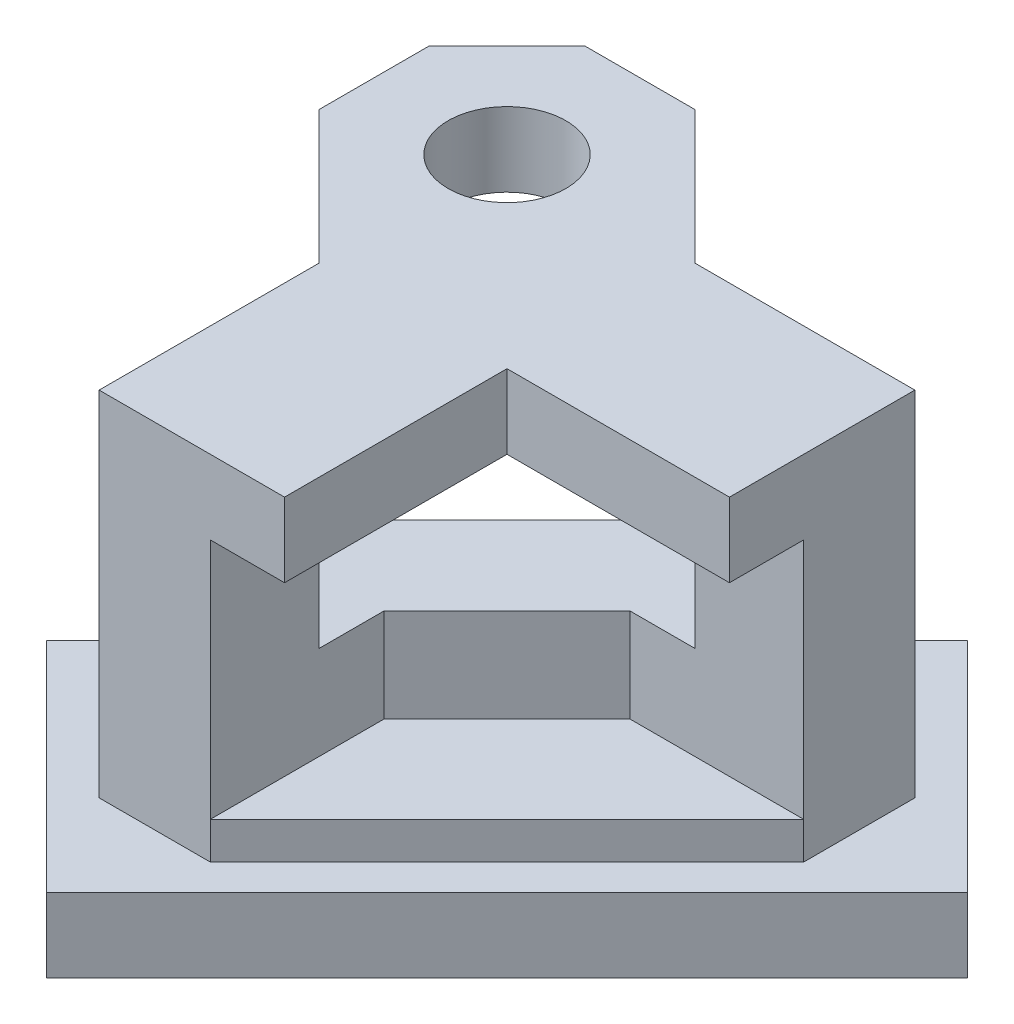
ISO-10303-21;
HEADER;
FILE_DESCRIPTION(('STEP AP214'),'2;1');
FILE_NAME('part.step','',(''),(''),'','','');
FILE_SCHEMA(('AUTOMOTIVE_DESIGN { 1 0 10303 214 1 1 1 1 }'));
ENDSEC;
DATA;
#1=APPLICATION_CONTEXT('core data for automotive mechanical design processes');
#2=APPLICATION_PROTOCOL_DEFINITION('international standard','automotive_design',2000,#1);
#3=PRODUCT_CONTEXT('',#1,'mechanical');
#4=PRODUCT('Part','Part','',(#3));
#5=PRODUCT_RELATED_PRODUCT_CATEGORY('part','',(#4));
#6=PRODUCT_DEFINITION_FORMATION('','',#4);
#7=PRODUCT_DEFINITION_CONTEXT('part definition',#1,'design');
#8=PRODUCT_DEFINITION('design','',#6,#7);
#9=PRODUCT_DEFINITION_SHAPE('','',#8);
#10=(LENGTH_UNIT() NAMED_UNIT(*) SI_UNIT(.MILLI.,.METRE.));
#11=(NAMED_UNIT(*) PLANE_ANGLE_UNIT() SI_UNIT($,.RADIAN.));
#12=(NAMED_UNIT(*) SI_UNIT($,.STERADIAN.) SOLID_ANGLE_UNIT());
#13=UNCERTAINTY_MEASURE_WITH_UNIT(LENGTH_MEASURE(1.E-05),#10,'distance_accuracy_value','');
#14=(GEOMETRIC_REPRESENTATION_CONTEXT(3) GLOBAL_UNCERTAINTY_ASSIGNED_CONTEXT((#13)) GLOBAL_UNIT_ASSIGNED_CONTEXT((#10,
#11,#12)) REPRESENTATION_CONTEXT('',''));
#15=CARTESIAN_POINT('',(0.,0.,0.));
#16=DIRECTION('',(0.,0.,1.));
#17=DIRECTION('',(1.,0.,0.));
#18=AXIS2_PLACEMENT_3D('',#15,#16,#17);
#19=CARTESIAN_POINT('',(0.,-4.,0.));
#20=DIRECTION('',(0.,1.,0.));
#21=DIRECTION('',(0.,0.,1.));
#22=AXIS2_PLACEMENT_3D('',#19,#20,#21);
#23=PLANE('',#22);
#24=CARTESIAN_POINT('',(-11.,-4.,-11.));
#25=DIRECTION('',(0.,1.,0.));
#26=DIRECTION('',(0.,0.,1.));
#27=AXIS2_PLACEMENT_3D('',#24,#25,#26);
#28=CIRCLE('',#27,3.175);
#29=CARTESIAN_POINT('',(-11.,-4.,-7.825));
#30=VERTEX_POINT('',#29);
#31=EDGE_CURVE('E355',#30,#30,#28,.T.);
#32=ORIENTED_EDGE('',*,*,#31,.T.);
#33=EDGE_LOOP('',(#32));
#34=FACE_BOUND('',#33,.T.);
#35=DIRECTION('',(0.707106781186547,0.,0.707106781186548));
#36=VECTOR('',#35,1.);
#37=CARTESIAN_POINT('',(-11.,-4.,-0.853017689973047));
#38=LINE('',#37,#36);
#39=CARTESIAN_POINT('',(-11.,-4.,-0.853017689973047));
#40=VERTEX_POINT('',#39);
#41=CARTESIAN_POINT('',(-5.,-4.,5.14698231002697));
#42=VERTEX_POINT('',#41);
#43=EDGE_CURVE('E334',#40,#42,#38,.T.);
#44=ORIENTED_EDGE('',*,*,#43,.F.);
#45=DIRECTION('',(0.707106781186548,0.,0.707106781186547));
#46=VECTOR('',#45,1.);
#47=CARTESIAN_POINT('',(-18.175,-4.,-8.02801768997304));
#48=LINE('',#47,#46);
#49=CARTESIAN_POINT('',(-18.175,-4.,-8.02801768997304));
#50=VERTEX_POINT('',#49);
#51=EDGE_CURVE('E382',#50,#40,#48,.T.);
#52=ORIENTED_EDGE('',*,*,#51,.F.);
#53=DIRECTION('',(0.,0.,1.));
#54=VECTOR('',#53,1.);
#55=CARTESIAN_POINT('',(-18.175,-4.,-13.971982310027));
#56=LINE('',#55,#54);
#57=CARTESIAN_POINT('',(-18.175,-4.,-13.971982310027));
#58=VERTEX_POINT('',#57);
#59=EDGE_CURVE('E379',#58,#50,#56,.T.);
#60=ORIENTED_EDGE('',*,*,#59,.F.);
#61=DIRECTION('',(-0.707106781186547,0.,0.707106781186548));
#62=VECTOR('',#61,1.);
#63=CARTESIAN_POINT('',(-13.971982310027,-4.,-18.175));
#64=LINE('',#63,#62);
#65=CARTESIAN_POINT('',(-13.971982310027,-4.,-18.175));
#66=VERTEX_POINT('',#65);
#67=EDGE_CURVE('E376',#66,#58,#64,.T.);
#68=ORIENTED_EDGE('',*,*,#67,.F.);
#69=DIRECTION('',(1.,0.,0.));
#70=VECTOR('',#69,1.);
#71=CARTESIAN_POINT('',(-13.971982310027,-4.,-18.175));
#72=LINE('',#71,#70);
#73=CARTESIAN_POINT('',(-8.02801768997306,-4.,-18.175));
#74=VERTEX_POINT('',#73);
#75=EDGE_CURVE('E374',#66,#74,#72,.T.);
#76=ORIENTED_EDGE('',*,*,#75,.T.);
#77=DIRECTION('',(0.707106781186548,0.,0.707106781186547));
#78=VECTOR('',#77,1.);
#79=CARTESIAN_POINT('',(-8.02801768997306,-4.,-18.175));
#80=LINE('',#79,#78);
#81=CARTESIAN_POINT('',(-0.853017689973053,-4.,-11.));
#82=VERTEX_POINT('',#81);
#83=EDGE_CURVE('E372',#74,#82,#80,.T.);
#84=ORIENTED_EDGE('',*,*,#83,.T.);
#85=DIRECTION('',(-0.707106781186547,0.,-0.707106781186548));
#86=VECTOR('',#85,1.);
#87=CARTESIAN_POINT('',(-0.853017689973053,-4.,-11.));
#88=LINE('',#87,#86);
#89=CARTESIAN_POINT('',(5.14698231002694,-4.,-5.));
#90=VERTEX_POINT('',#89);
#91=EDGE_CURVE('E336',#90,#82,#88,.T.);
#92=ORIENTED_EDGE('',*,*,#91,.F.);
#93=DIRECTION('',(-1.,0.,0.));
#94=VECTOR('',#93,1.);
#95=CARTESIAN_POINT('',(5.14698231002694,-4.,-5.));
#96=LINE('',#95,#94);
#97=CARTESIAN_POINT('',(11.,-4.,-5.));
#98=VERTEX_POINT('',#97);
#99=EDGE_CURVE('E99',#98,#90,#96,.T.);
#100=ORIENTED_EDGE('',*,*,#99,.F.);
#101=DIRECTION('',(0.,0.,-1.));
#102=VECTOR('',#101,1.);
#103=CARTESIAN_POINT('',(11.,-4.,-1.));
#104=LINE('',#103,#102);
#105=CARTESIAN_POINT('',(11.,-4.,-1.));
#106=VERTEX_POINT('',#105);
#107=EDGE_CURVE('E370',#106,#98,#104,.T.);
#108=ORIENTED_EDGE('',*,*,#107,.F.);
#109=DIRECTION('',(1.,0.,0.));
#110=VECTOR('',#109,1.);
#111=CARTESIAN_POINT('',(-0.999999999999998,-4.,-0.999999999999999));
#112=LINE('',#111,#110);
#113=CARTESIAN_POINT('',(-0.999999999999998,-4.,-0.999999999999999));
#114=VERTEX_POINT('',#113);
#115=EDGE_CURVE('E367',#114,#106,#112,.T.);
#116=ORIENTED_EDGE('',*,*,#115,.F.);
#117=DIRECTION('',(0.,0.,-1.));
#118=VECTOR('',#117,1.);
#119=CARTESIAN_POINT('',(-0.999999999999999,-4.,11.));
#120=LINE('',#119,#118);
#121=CARTESIAN_POINT('',(-0.999999999999999,-4.,11.));
#122=VERTEX_POINT('',#121);
#123=EDGE_CURVE('E363',#122,#114,#120,.T.);
#124=ORIENTED_EDGE('',*,*,#123,.F.);
#125=DIRECTION('',(1.,0.,0.));
#126=VECTOR('',#125,1.);
#127=CARTESIAN_POINT('',(-11.,-4.,11.));
#128=LINE('',#127,#126);
#129=CARTESIAN_POINT('',(-5.,-4.,11.));
#130=VERTEX_POINT('',#129);
#131=EDGE_CURVE('E361',#130,#122,#128,.T.);
#132=ORIENTED_EDGE('',*,*,#131,.F.);
#133=DIRECTION('',(0.,0.,1.));
#134=VECTOR('',#133,1.);
#135=CARTESIAN_POINT('',(-5.,-4.,5.14698231002697));
#136=LINE('',#135,#134);
#137=EDGE_CURVE('E332',#42,#130,#136,.T.);
#138=ORIENTED_EDGE('',*,*,#137,.F.);
#139=EDGE_LOOP('',(#44,#52,#60,#68,#76,#84,#92,#100,#108,#116,#124,#132,#138));
#140=FACE_BOUND('',#139,.T.);
#141=ADVANCED_FACE('F74',(#34,#140),#23,.F.);
#142=CARTESIAN_POINT('',(-11.,-4.,-0.853017689973047));
#143=DIRECTION('',(-1.,0.,0.));
#144=DIRECTION('',(0.,0.,1.));
#145=AXIS2_PLACEMENT_3D('',#142,#143,#144);
#146=PLANE('',#145);
#147=DIRECTION('',(0.,0.,1.));
#148=VECTOR('',#147,1.);
#149=CARTESIAN_POINT('',(-11.,0.,-0.853017689973047));
#150=LINE('',#149,#148);
#151=CARTESIAN_POINT('',(-11.,0.,-0.853017689973047));
#152=VERTEX_POINT('',#151);
#153=CARTESIAN_POINT('',(-11.,0.,11.));
#154=VERTEX_POINT('',#153);
#155=EDGE_CURVE('E358',#152,#154,#150,.T.);
#156=ORIENTED_EDGE('',*,*,#155,.F.);
#157=DIRECTION('',(0.,1.,0.));
#158=VECTOR('',#157,1.);
#159=CARTESIAN_POINT('',(-11.,-4.,-0.853017689973047));
#160=LINE('',#159,#158);
#161=EDGE_CURVE('E12',#40,#152,#160,.T.);
#162=ORIENTED_EDGE('',*,*,#161,.F.);
#163=DIRECTION('',(0.,1.,0.));
#164=VECTOR('',#163,1.);
#165=CARTESIAN_POINT('',(-11.,-12.,-0.853017689973047));
#166=LINE('',#165,#164);
#167=CARTESIAN_POINT('',(-11.,-12.,-0.853017689973047));
#168=VERTEX_POINT('',#167);
#169=EDGE_CURVE('E325',#168,#40,#166,.T.);
#170=ORIENTED_EDGE('',*,*,#169,.F.);
#171=DIRECTION('',(0.,1.,0.));
#172=VECTOR('',#171,1.);
#173=CARTESIAN_POINT('',(-11.,-17.05,-0.853017689973047));
#174=LINE('',#173,#172);
#175=CARTESIAN_POINT('',(-11.,-19.05,-0.853017689973047));
#176=VERTEX_POINT('',#175);
#177=EDGE_CURVE('E316',#176,#168,#174,.T.);
#178=ORIENTED_EDGE('',*,*,#177,.F.);
#179=DIRECTION('',(0.,0.,-1.));
#180=VECTOR('',#179,1.);
#181=CARTESIAN_POINT('',(-11.,-19.05,11.));
#182=LINE('',#181,#180);
#183=CARTESIAN_POINT('',(-11.,-19.05,11.));
#184=VERTEX_POINT('',#183);
#185=EDGE_CURVE('E276',#184,#176,#182,.T.);
#186=ORIENTED_EDGE('',*,*,#185,.F.);
#187=DIRECTION('',(0.,1.,0.));
#188=VECTOR('',#187,1.);
#189=CARTESIAN_POINT('',(-11.,-4.,11.));
#190=LINE('',#189,#188);
#191=EDGE_CURVE('E78',#184,#154,#190,.T.);
#192=ORIENTED_EDGE('',*,*,#191,.T.);
#193=EDGE_LOOP('',(#156,#162,#170,#178,#186,#192));
#194=FACE_BOUND('',#193,.T.);
#195=ADVANCED_FACE('F76',(#194),#146,.T.);
#196=CARTESIAN_POINT('',(-18.175,-4.,-8.02801768997304));
#197=DIRECTION('',(-0.707106781186547,0.,0.707106781186548));
#198=DIRECTION('',(0.707106781186548,0.,0.707106781186547));
#199=AXIS2_PLACEMENT_3D('',#196,#197,#198);
#200=PLANE('',#199);
#201=DIRECTION('',(0.707106781186548,0.,0.707106781186547));
#202=VECTOR('',#201,1.);
#203=CARTESIAN_POINT('',(-18.175,0.,-8.02801768997304));
#204=LINE('',#203,#202);
#205=CARTESIAN_POINT('',(-18.175,0.,-8.02801768997304));
#206=VERTEX_POINT('',#205);
#207=EDGE_CURVE('E364',#206,#152,#204,.T.);
#208=ORIENTED_EDGE('',*,*,#207,.F.);
#209=DIRECTION('',(0.,1.,0.));
#210=VECTOR('',#209,1.);
#211=CARTESIAN_POINT('',(-18.175,-4.,-8.02801768997304));
#212=LINE('',#211,#210);
#213=EDGE_CURVE('E83',#50,#206,#212,.T.);
#214=ORIENTED_EDGE('',*,*,#213,.F.);
#215=ORIENTED_EDGE('',*,*,#51,.T.);
#216=ORIENTED_EDGE('',*,*,#161,.T.);
#217=EDGE_LOOP('',(#208,#214,#215,#216));
#218=FACE_BOUND('',#217,.T.);
#219=ADVANCED_FACE('F444',(#218),#200,.T.);
#220=CARTESIAN_POINT('',(-18.175,-4.,-13.971982310027));
#221=DIRECTION('',(-1.,0.,0.));
#222=DIRECTION('',(0.,0.,1.));
#223=AXIS2_PLACEMENT_3D('',#220,#221,#222);
#224=PLANE('',#223);
#225=DIRECTION('',(0.,0.,1.));
#226=VECTOR('',#225,1.);
#227=CARTESIAN_POINT('',(-18.175,0.,-13.971982310027));
#228=LINE('',#227,#226);
#229=CARTESIAN_POINT('',(-18.175,0.,-13.971982310027));
#230=VERTEX_POINT('',#229);
#231=EDGE_CURVE('E409',#230,#206,#228,.T.);
#232=ORIENTED_EDGE('',*,*,#231,.F.);
#233=DIRECTION('',(0.,1.,0.));
#234=VECTOR('',#233,1.);
#235=CARTESIAN_POINT('',(-18.175,-4.,-13.971982310027));
#236=LINE('',#235,#234);
#237=EDGE_CURVE('E415',#58,#230,#236,.T.);
#238=ORIENTED_EDGE('',*,*,#237,.F.);
#239=ORIENTED_EDGE('',*,*,#59,.T.);
#240=ORIENTED_EDGE('',*,*,#213,.T.);
#241=EDGE_LOOP('',(#232,#238,#239,#240));
#242=FACE_BOUND('',#241,.T.);
#243=ADVANCED_FACE('F507',(#242),#224,.T.);
#244=CARTESIAN_POINT('',(-13.971982310027,-4.,-18.175));
#245=DIRECTION('',(-0.707106781186548,0.,-0.707106781186547));
#246=DIRECTION('',(-0.707106781186547,0.,0.707106781186548));
#247=AXIS2_PLACEMENT_3D('',#244,#245,#246);
#248=PLANE('',#247);
#249=DIRECTION('',(-0.707106781186547,0.,0.707106781186548));
#250=VECTOR('',#249,1.);
#251=CARTESIAN_POINT('',(-13.971982310027,0.,-18.175));
#252=LINE('',#251,#250);
#253=CARTESIAN_POINT('',(-13.971982310027,0.,-18.175));
#254=VERTEX_POINT('',#253);
#255=EDGE_CURVE('E406',#254,#230,#252,.T.);
#256=ORIENTED_EDGE('',*,*,#255,.F.);
#257=DIRECTION('',(0.,1.,0.));
#258=VECTOR('',#257,1.);
#259=CARTESIAN_POINT('',(-13.971982310027,-4.,-18.175));
#260=LINE('',#259,#258);
#261=EDGE_CURVE('E417',#66,#254,#260,.T.);
#262=ORIENTED_EDGE('',*,*,#261,.F.);
#263=ORIENTED_EDGE('',*,*,#67,.T.);
#264=ORIENTED_EDGE('',*,*,#237,.T.);
#265=EDGE_LOOP('',(#256,#262,#263,#264));
#266=FACE_BOUND('',#265,.T.);
#267=ADVANCED_FACE('F504',(#266),#248,.T.);
#268=CARTESIAN_POINT('',(-13.971982310027,-4.,-18.175));
#269=DIRECTION('',(0.,0.,1.));
#270=DIRECTION('',(1.,0.,0.));
#271=AXIS2_PLACEMENT_3D('',#268,#269,#270);
#272=PLANE('',#271);
#273=DIRECTION('',(1.,0.,0.));
#274=VECTOR('',#273,1.);
#275=CARTESIAN_POINT('',(-13.971982310027,0.,-18.175));
#276=LINE('',#275,#274);
#277=CARTESIAN_POINT('',(-8.02801768997306,0.,-18.175));
#278=VERTEX_POINT('',#277);
#279=EDGE_CURVE('E404',#254,#278,#276,.T.);
#280=ORIENTED_EDGE('',*,*,#279,.T.);
#281=DIRECTION('',(0.,1.,0.));
#282=VECTOR('',#281,1.);
#283=CARTESIAN_POINT('',(-8.02801768997306,-4.,-18.175));
#284=LINE('',#283,#282);
#285=EDGE_CURVE('E419',#74,#278,#284,.T.);
#286=ORIENTED_EDGE('',*,*,#285,.F.);
#287=ORIENTED_EDGE('',*,*,#75,.F.);
#288=ORIENTED_EDGE('',*,*,#261,.T.);
#289=EDGE_LOOP('',(#280,#286,#287,#288));
#290=FACE_BOUND('',#289,.T.);
#291=ADVANCED_FACE('F501',(#290),#272,.F.);
#292=CARTESIAN_POINT('',(-8.02801768997306,-4.,-18.175));
#293=DIRECTION('',(-0.707106781186547,0.,0.707106781186548));
#294=DIRECTION('',(0.707106781186548,0.,0.707106781186547));
#295=AXIS2_PLACEMENT_3D('',#292,#293,#294);
#296=PLANE('',#295);
#297=DIRECTION('',(0.707106781186548,0.,0.707106781186547));
#298=VECTOR('',#297,1.);
#299=CARTESIAN_POINT('',(-8.02801768997306,0.,-18.175));
#300=LINE('',#299,#298);
#301=CARTESIAN_POINT('',(-0.853017689973053,0.,-11.));
#302=VERTEX_POINT('',#301);
#303=EDGE_CURVE('E402',#278,#302,#300,.T.);
#304=ORIENTED_EDGE('',*,*,#303,.T.);
#305=DIRECTION('',(0.,1.,0.));
#306=VECTOR('',#305,1.);
#307=CARTESIAN_POINT('',(-0.853017689973053,-4.,-11.));
#308=LINE('',#307,#306);
#309=EDGE_CURVE('E422',#82,#302,#308,.T.);
#310=ORIENTED_EDGE('',*,*,#309,.F.);
#311=ORIENTED_EDGE('',*,*,#83,.F.);
#312=ORIENTED_EDGE('',*,*,#285,.T.);
#313=EDGE_LOOP('',(#304,#310,#311,#312));
#314=FACE_BOUND('',#313,.T.);
#315=ADVANCED_FACE('F496',(#314),#296,.F.);
#316=CARTESIAN_POINT('',(-0.853017689973053,-4.,-11.));
#317=DIRECTION('',(0.,0.,1.));
#318=DIRECTION('',(1.,0.,0.));
#319=AXIS2_PLACEMENT_3D('',#316,#317,#318);
#320=PLANE('',#319);
#321=DIRECTION('',(1.,0.,0.));
#322=VECTOR('',#321,1.);
#323=CARTESIAN_POINT('',(-0.853017689973053,0.,-11.));
#324=LINE('',#323,#322);
#325=CARTESIAN_POINT('',(11.,0.,-11.));
#326=VERTEX_POINT('',#325);
#327=EDGE_CURVE('E399',#302,#326,#324,.T.);
#328=ORIENTED_EDGE('',*,*,#327,.T.);
#329=DIRECTION('',(0.,1.,0.));
#330=VECTOR('',#329,1.);
#331=CARTESIAN_POINT('',(11.,-4.,-11.));
#332=LINE('',#331,#330);
#333=CARTESIAN_POINT('',(11.,-19.05,-11.));
#334=VERTEX_POINT('',#333);
#335=EDGE_CURVE('E425',#334,#326,#332,.T.);
#336=ORIENTED_EDGE('',*,*,#335,.F.);
#337=DIRECTION('',(1.,0.,0.));
#338=VECTOR('',#337,1.);
#339=CARTESIAN_POINT('',(-0.853017689973053,-19.05,-11.));
#340=LINE('',#339,#338);
#341=CARTESIAN_POINT('',(-0.853017689973053,-19.05,-11.));
#342=VERTEX_POINT('',#341);
#343=EDGE_CURVE('E282',#342,#334,#340,.T.);
#344=ORIENTED_EDGE('',*,*,#343,.F.);
#345=DIRECTION('',(0.,1.,0.));
#346=VECTOR('',#345,1.);
#347=CARTESIAN_POINT('',(-0.853017689973053,-17.05,-11.));
#348=LINE('',#347,#346);
#349=CARTESIAN_POINT('',(-0.853017689973053,-12.,-11.));
#350=VERTEX_POINT('',#349);
#351=EDGE_CURVE('E304',#342,#350,#348,.T.);
#352=ORIENTED_EDGE('',*,*,#351,.T.);
#353=DIRECTION('',(0.,1.,0.));
#354=VECTOR('',#353,1.);
#355=CARTESIAN_POINT('',(-0.853017689973053,-12.,-11.));
#356=LINE('',#355,#354);
#357=EDGE_CURVE('E351',#350,#82,#356,.T.);
#358=ORIENTED_EDGE('',*,*,#357,.T.);
#359=ORIENTED_EDGE('',*,*,#309,.T.);
#360=EDGE_LOOP('',(#328,#336,#344,#352,#358,#359));
#361=FACE_BOUND('',#360,.T.);
#362=ADVANCED_FACE('F462',(#361),#320,.F.);
#363=CARTESIAN_POINT('',(11.,-4.,-1.));
#364=DIRECTION('',(1.,0.,0.));
#365=DIRECTION('',(0.,0.,-1.));
#366=AXIS2_PLACEMENT_3D('',#363,#364,#365);
#367=PLANE('',#366);
#368=DIRECTION('',(0.,0.,-1.));
#369=VECTOR('',#368,1.);
#370=CARTESIAN_POINT('',(11.,0.,-1.));
#371=LINE('',#370,#369);
#372=CARTESIAN_POINT('',(11.,0.,-1.));
#373=VERTEX_POINT('',#372);
#374=EDGE_CURVE('E396',#373,#326,#371,.T.);
#375=ORIENTED_EDGE('',*,*,#374,.F.);
#376=DIRECTION('',(0.,1.,0.));
#377=VECTOR('',#376,1.);
#378=CARTESIAN_POINT('',(11.,-4.,-1.));
#379=LINE('',#378,#377);
#380=EDGE_CURVE('E427',#106,#373,#379,.T.);
#381=ORIENTED_EDGE('',*,*,#380,.F.);
#382=ORIENTED_EDGE('',*,*,#107,.T.);
#383=DIRECTION('',(0.,1.,0.));
#384=VECTOR('',#383,1.);
#385=CARTESIAN_POINT('',(11.,-12.,-5.));
#386=LINE('',#385,#384);
#387=CARTESIAN_POINT('',(11.,-17.05,-5.));
#388=VERTEX_POINT('',#387);
#389=EDGE_CURVE('E348',#388,#98,#386,.T.);
#390=ORIENTED_EDGE('',*,*,#389,.F.);
#391=DIRECTION('',(0.,1.,0.));
#392=VECTOR('',#391,1.);
#393=CARTESIAN_POINT('',(11.,-19.05,-5.));
#394=LINE('',#393,#392);
#395=CARTESIAN_POINT('',(11.,-19.05,-5.));
#396=VERTEX_POINT('',#395);
#397=EDGE_CURVE('E287',#396,#388,#394,.T.);
#398=ORIENTED_EDGE('',*,*,#397,.F.);
#399=DIRECTION('',(0.,0.,1.));
#400=VECTOR('',#399,1.);
#401=CARTESIAN_POINT('',(11.,-19.05,-11.));
#402=LINE('',#401,#400);
#403=EDGE_CURVE('E285',#334,#396,#402,.T.);
#404=ORIENTED_EDGE('',*,*,#403,.F.);
#405=ORIENTED_EDGE('',*,*,#335,.T.);
#406=EDGE_LOOP('',(#375,#381,#382,#390,#398,#404,#405));
#407=FACE_BOUND('',#406,.T.);
#408=ADVANCED_FACE('F491',(#407),#367,.T.);
#409=CARTESIAN_POINT('',(-0.999999999999998,-4.,-0.999999999999999));
#410=DIRECTION('',(0.,0.,1.));
#411=DIRECTION('',(1.,0.,0.));
#412=AXIS2_PLACEMENT_3D('',#409,#410,#411);
#413=PLANE('',#412);
#414=DIRECTION('',(1.,0.,0.));
#415=VECTOR('',#414,1.);
#416=CARTESIAN_POINT('',(-0.999999999999998,0.,-0.999999999999999));
#417=LINE('',#416,#415);
#418=CARTESIAN_POINT('',(-0.999999999999998,0.,-0.999999999999999));
#419=VERTEX_POINT('',#418);
#420=EDGE_CURVE('E393',#419,#373,#417,.T.);
#421=ORIENTED_EDGE('',*,*,#420,.F.);
#422=DIRECTION('',(0.,1.,0.));
#423=VECTOR('',#422,1.);
#424=CARTESIAN_POINT('',(-0.999999999999998,-4.,-0.999999999999999));
#425=LINE('',#424,#423);
#426=EDGE_CURVE('E429',#114,#419,#425,.T.);
#427=ORIENTED_EDGE('',*,*,#426,.F.);
#428=ORIENTED_EDGE('',*,*,#115,.T.);
#429=ORIENTED_EDGE('',*,*,#380,.T.);
#430=EDGE_LOOP('',(#421,#427,#428,#429));
#431=FACE_BOUND('',#430,.T.);
#432=ADVANCED_FACE('F489',(#431),#413,.T.);
#433=CARTESIAN_POINT('',(-0.999999999999999,-4.,11.));
#434=DIRECTION('',(1.,0.,0.));
#435=DIRECTION('',(0.,0.,-1.));
#436=AXIS2_PLACEMENT_3D('',#433,#434,#435);
#437=PLANE('',#436);
#438=DIRECTION('',(0.,0.,-1.));
#439=VECTOR('',#438,1.);
#440=CARTESIAN_POINT('',(-0.999999999999999,0.,11.));
#441=LINE('',#440,#439);
#442=CARTESIAN_POINT('',(-0.999999999999999,0.,11.));
#443=VERTEX_POINT('',#442);
#444=EDGE_CURVE('E390',#443,#419,#441,.T.);
#445=ORIENTED_EDGE('',*,*,#444,.F.);
#446=DIRECTION('',(0.,1.,0.));
#447=VECTOR('',#446,1.);
#448=CARTESIAN_POINT('',(-0.999999999999999,-4.,11.));
#449=LINE('',#448,#447);
#450=EDGE_CURVE('E430',#122,#443,#449,.T.);
#451=ORIENTED_EDGE('',*,*,#450,.F.);
#452=ORIENTED_EDGE('',*,*,#123,.T.);
#453=ORIENTED_EDGE('',*,*,#426,.T.);
#454=EDGE_LOOP('',(#445,#451,#452,#453));
#455=FACE_BOUND('',#454,.T.);
#456=ADVANCED_FACE('F485',(#455),#437,.T.);
#457=CARTESIAN_POINT('',(-11.,-4.,11.));
#458=DIRECTION('',(0.,0.,1.));
#459=DIRECTION('',(1.,0.,0.));
#460=AXIS2_PLACEMENT_3D('',#457,#458,#459);
#461=PLANE('',#460);
#462=DIRECTION('',(1.,0.,0.));
#463=VECTOR('',#462,1.);
#464=CARTESIAN_POINT('',(-11.,0.,11.));
#465=LINE('',#464,#463);
#466=EDGE_CURVE('E387',#154,#443,#465,.T.);
#467=ORIENTED_EDGE('',*,*,#466,.F.);
#468=ORIENTED_EDGE('',*,*,#191,.F.);
#469=DIRECTION('',(-1.,0.,0.));
#470=VECTOR('',#469,1.);
#471=CARTESIAN_POINT('',(-5.,-19.05,11.));
#472=LINE('',#471,#470);
#473=CARTESIAN_POINT('',(-5.,-19.05,11.));
#474=VERTEX_POINT('',#473);
#475=EDGE_CURVE('E273',#474,#184,#472,.T.);
#476=ORIENTED_EDGE('',*,*,#475,.F.);
#477=DIRECTION('',(0.,1.,0.));
#478=VECTOR('',#477,1.);
#479=CARTESIAN_POINT('',(-5.,-19.05,11.));
#480=LINE('',#479,#478);
#481=CARTESIAN_POINT('',(-5.,-17.05,11.));
#482=VERTEX_POINT('',#481);
#483=EDGE_CURVE('E291',#474,#482,#480,.T.);
#484=ORIENTED_EDGE('',*,*,#483,.T.);
#485=DIRECTION('',(0.,1.,0.));
#486=VECTOR('',#485,1.);
#487=CARTESIAN_POINT('',(-5.,-12.,11.));
#488=LINE('',#487,#486);
#489=EDGE_CURVE('E91',#482,#130,#488,.T.);
#490=ORIENTED_EDGE('',*,*,#489,.T.);
#491=ORIENTED_EDGE('',*,*,#131,.T.);
#492=ORIENTED_EDGE('',*,*,#450,.T.);
#493=EDGE_LOOP('',(#467,#468,#476,#484,#490,#491,#492));
#494=FACE_BOUND('',#493,.T.);
#495=ADVANCED_FACE('F438',(#494),#461,.T.);
#496=CARTESIAN_POINT('',(0.,0.,0.));
#497=DIRECTION('',(0.,1.,0.));
#498=DIRECTION('',(0.,0.,1.));
#499=AXIS2_PLACEMENT_3D('',#496,#497,#498);
#500=PLANE('',#499);
#501=CARTESIAN_POINT('',(-11.,0.,-11.));
#502=DIRECTION('',(0.,1.,0.));
#503=DIRECTION('',(0.,0.,1.));
#504=AXIS2_PLACEMENT_3D('',#501,#502,#503);
#505=CIRCLE('',#504,3.175);
#506=CARTESIAN_POINT('',(-11.,0.,-7.825));
#507=VERTEX_POINT('',#506);
#508=EDGE_CURVE('E354',#507,#507,#505,.T.);
#509=ORIENTED_EDGE('',*,*,#508,.F.);
#510=EDGE_LOOP('',(#509));
#511=FACE_BOUND('',#510,.T.);
#512=ORIENTED_EDGE('',*,*,#155,.T.);
#513=ORIENTED_EDGE('',*,*,#466,.T.);
#514=ORIENTED_EDGE('',*,*,#444,.T.);
#515=ORIENTED_EDGE('',*,*,#420,.T.);
#516=ORIENTED_EDGE('',*,*,#374,.T.);
#517=ORIENTED_EDGE('',*,*,#327,.F.);
#518=ORIENTED_EDGE('',*,*,#303,.F.);
#519=ORIENTED_EDGE('',*,*,#279,.F.);
#520=ORIENTED_EDGE('',*,*,#255,.T.);
#521=ORIENTED_EDGE('',*,*,#231,.T.);
#522=ORIENTED_EDGE('',*,*,#207,.T.);
#523=EDGE_LOOP('',(#512,#513,#514,#515,#516,#517,#518,#519,#520,#521,#522));
#524=FACE_BOUND('',#523,.T.);
#525=ADVANCED_FACE('F440',(#511,#524),#500,.T.);
#526=CARTESIAN_POINT('',(-11.,-4.,-11.));
#527=DIRECTION('',(0.,1.,0.));
#528=DIRECTION('',(0.,0.,1.));
#529=AXIS2_PLACEMENT_3D('',#526,#527,#528);
#530=CYLINDRICAL_SURFACE('',#529,3.175);
#531=ORIENTED_EDGE('',*,*,#31,.F.);
#532=EDGE_LOOP('',(#531));
#533=FACE_BOUND('',#532,.T.);
#534=ORIENTED_EDGE('',*,*,#508,.T.);
#535=EDGE_LOOP('',(#534));
#536=FACE_BOUND('',#535,.T.);
#537=ADVANCED_FACE('F530',(#533,#536),#530,.F.);
#538=CARTESIAN_POINT('',(-0.853017689973053,-12.,-11.));
#539=DIRECTION('',(0.707106781186548,0.,-0.707106781186547));
#540=DIRECTION('',(-0.707106781186547,0.,-0.707106781186548));
#541=AXIS2_PLACEMENT_3D('',#538,#539,#540);
#542=PLANE('',#541);
#543=ORIENTED_EDGE('',*,*,#91,.T.);
#544=ORIENTED_EDGE('',*,*,#357,.F.);
#545=DIRECTION('',(-0.707106781186547,0.,-0.707106781186548));
#546=VECTOR('',#545,1.);
#547=CARTESIAN_POINT('',(-0.853017689973053,-12.,-11.));
#548=LINE('',#547,#546);
#549=CARTESIAN_POINT('',(5.14698231002694,-12.,-5.));
#550=VERTEX_POINT('',#549);
#551=EDGE_CURVE('E339',#550,#350,#548,.T.);
#552=ORIENTED_EDGE('',*,*,#551,.F.);
#553=DIRECTION('',(0.,1.,0.));
#554=VECTOR('',#553,1.);
#555=CARTESIAN_POINT('',(5.14698231002694,-12.,-5.));
#556=LINE('',#555,#554);
#557=EDGE_CURVE('E342',#550,#90,#556,.T.);
#558=ORIENTED_EDGE('',*,*,#557,.T.);
#559=EDGE_LOOP('',(#543,#544,#552,#558));
#560=FACE_BOUND('',#559,.T.);
#561=ADVANCED_FACE('F460',(#560),#542,.F.);
#562=CARTESIAN_POINT('',(5.14698231002694,-12.,-5.));
#563=DIRECTION('',(0.,0.,-1.));
#564=DIRECTION('',(-1.,0.,0.));
#565=AXIS2_PLACEMENT_3D('',#562,#563,#564);
#566=PLANE('',#565);
#567=ORIENTED_EDGE('',*,*,#99,.T.);
#568=ORIENTED_EDGE('',*,*,#557,.F.);
#569=DIRECTION('',(-1.,0.,0.));
#570=VECTOR('',#569,1.);
#571=CARTESIAN_POINT('',(11.,-12.,-5.));
#572=LINE('',#571,#570);
#573=CARTESIAN_POINT('',(1.63226368426551,-12.,-5.));
#574=VERTEX_POINT('',#573);
#575=EDGE_CURVE('E298',#550,#574,#572,.T.);
#576=ORIENTED_EDGE('',*,*,#575,.T.);
#577=DIRECTION('',(0.,1.,0.));
#578=VECTOR('',#577,1.);
#579=CARTESIAN_POINT('',(1.63226368426551,-17.05,-5.));
#580=LINE('',#579,#578);
#581=CARTESIAN_POINT('',(1.63226368426551,-17.05,-5.));
#582=VERTEX_POINT('',#581);
#583=EDGE_CURVE('E322',#582,#574,#580,.T.);
#584=ORIENTED_EDGE('',*,*,#583,.F.);
#585=DIRECTION('',(-1.,0.,0.));
#586=VECTOR('',#585,1.);
#587=CARTESIAN_POINT('',(1.63226368426551,-17.05,-5.));
#588=LINE('',#587,#586);
#589=EDGE_CURVE('E294',#388,#582,#588,.T.);
#590=ORIENTED_EDGE('',*,*,#589,.F.);
#591=ORIENTED_EDGE('',*,*,#389,.T.);
#592=EDGE_LOOP('',(#567,#568,#576,#584,#590,#591));
#593=FACE_BOUND('',#592,.T.);
#594=ADVANCED_FACE('F509',(#593),#566,.F.);
#595=CARTESIAN_POINT('',(-11.,-12.,-0.853017689973047));
#596=DIRECTION('',(-0.707106781186548,0.,0.707106781186547));
#597=DIRECTION('',(0.707106781186547,0.,0.707106781186548));
#598=AXIS2_PLACEMENT_3D('',#595,#596,#597);
#599=PLANE('',#598);
#600=ORIENTED_EDGE('',*,*,#43,.T.);
#601=DIRECTION('',(0.,1.,0.));
#602=VECTOR('',#601,1.);
#603=CARTESIAN_POINT('',(-5.,-12.,5.14698231002697));
#604=LINE('',#603,#602);
#605=CARTESIAN_POINT('',(-5.,-12.,5.14698231002697));
#606=VERTEX_POINT('',#605);
#607=EDGE_CURVE('E327',#606,#42,#604,.T.);
#608=ORIENTED_EDGE('',*,*,#607,.F.);
#609=DIRECTION('',(0.707106781186547,0.,0.707106781186548));
#610=VECTOR('',#609,1.);
#611=CARTESIAN_POINT('',(-11.,-12.,-0.853017689973047));
#612=LINE('',#611,#610);
#613=EDGE_CURVE('E331',#168,#606,#612,.T.);
#614=ORIENTED_EDGE('',*,*,#613,.F.);
#615=ORIENTED_EDGE('',*,*,#169,.T.);
#616=EDGE_LOOP('',(#600,#608,#614,#615));
#617=FACE_BOUND('',#616,.T.);
#618=ADVANCED_FACE('F450',(#617),#599,.F.);
#619=CARTESIAN_POINT('',(-5.,-12.,5.14698231002697));
#620=DIRECTION('',(-1.,0.,0.));
#621=DIRECTION('',(0.,0.,1.));
#622=AXIS2_PLACEMENT_3D('',#619,#620,#621);
#623=PLANE('',#622);
#624=ORIENTED_EDGE('',*,*,#137,.T.);
#625=ORIENTED_EDGE('',*,*,#489,.F.);
#626=DIRECTION('',(0.,0.,1.));
#627=VECTOR('',#626,1.);
#628=CARTESIAN_POINT('',(-5.,-17.05,5.14698231002697));
#629=LINE('',#628,#627);
#630=CARTESIAN_POINT('',(-5.,-17.05,1.63226368426549));
#631=VERTEX_POINT('',#630);
#632=EDGE_CURVE('E301',#631,#482,#629,.T.);
#633=ORIENTED_EDGE('',*,*,#632,.F.);
#634=DIRECTION('',(0.,1.,0.));
#635=VECTOR('',#634,1.);
#636=CARTESIAN_POINT('',(-5.,-17.05,1.63226368426549));
#637=LINE('',#636,#635);
#638=CARTESIAN_POINT('',(-5.,-12.,1.63226368426549));
#639=VERTEX_POINT('',#638);
#640=EDGE_CURVE('E319',#631,#639,#637,.T.);
#641=ORIENTED_EDGE('',*,*,#640,.T.);
#642=DIRECTION('',(0.,0.,1.));
#643=VECTOR('',#642,1.);
#644=CARTESIAN_POINT('',(-5.,-12.,5.14698231002697));
#645=LINE('',#644,#643);
#646=EDGE_CURVE('E307',#639,#606,#645,.T.);
#647=ORIENTED_EDGE('',*,*,#646,.T.);
#648=ORIENTED_EDGE('',*,*,#607,.T.);
#649=EDGE_LOOP('',(#624,#625,#633,#641,#647,#648));
#650=FACE_BOUND('',#649,.T.);
#651=ADVANCED_FACE('F479',(#650),#623,.F.);
#652=CARTESIAN_POINT('',(0.,-12.,0.));
#653=DIRECTION('',(0.,-1.,0.));
#654=DIRECTION('',(0.,0.,-1.));
#655=AXIS2_PLACEMENT_3D('',#652,#653,#654);
#656=PLANE('',#655);
#657=ORIENTED_EDGE('',*,*,#575,.F.);
#658=ORIENTED_EDGE('',*,*,#551,.T.);
#659=DIRECTION('',(0.707106781186547,0.,-0.707106781186548));
#660=VECTOR('',#659,1.);
#661=CARTESIAN_POINT('',(-11.,-12.,-0.853017689973047));
#662=LINE('',#661,#660);
#663=EDGE_CURVE('E310',#168,#350,#662,.T.);
#664=ORIENTED_EDGE('',*,*,#663,.F.);
#665=ORIENTED_EDGE('',*,*,#613,.T.);
#666=ORIENTED_EDGE('',*,*,#646,.F.);
#667=DIRECTION('',(-0.707106781186548,0.,0.707106781186547));
#668=VECTOR('',#667,1.);
#669=CARTESIAN_POINT('',(-5.,-12.,1.63226368426549));
#670=LINE('',#669,#668);
#671=EDGE_CURVE('E293',#574,#639,#670,.T.);
#672=ORIENTED_EDGE('',*,*,#671,.F.);
#673=EDGE_LOOP('',(#657,#658,#664,#665,#666,#672));
#674=FACE_BOUND('',#673,.T.);
#675=ADVANCED_FACE('F456',(#674),#656,.F.);
#676=CARTESIAN_POINT('',(-5.,-17.05,1.63226368426549));
#677=DIRECTION('',(-0.707106781186547,0.,-0.707106781186548));
#678=DIRECTION('',(-0.707106781186548,0.,0.707106781186547));
#679=AXIS2_PLACEMENT_3D('',#676,#677,#678);
#680=PLANE('',#679);
#681=ORIENTED_EDGE('',*,*,#671,.T.);
#682=ORIENTED_EDGE('',*,*,#640,.F.);
#683=DIRECTION('',(-0.707106781186548,0.,0.707106781186547));
#684=VECTOR('',#683,1.);
#685=CARTESIAN_POINT('',(-5.,-17.05,1.63226368426549));
#686=LINE('',#685,#684);
#687=EDGE_CURVE('E297',#582,#631,#686,.T.);
#688=ORIENTED_EDGE('',*,*,#687,.F.);
#689=ORIENTED_EDGE('',*,*,#583,.T.);
#690=EDGE_LOOP('',(#681,#682,#688,#689));
#691=FACE_BOUND('',#690,.T.);
#692=ADVANCED_FACE('F512',(#691),#680,.F.);
#693=CARTESIAN_POINT('',(-11.,-17.05,-0.853017689973047));
#694=DIRECTION('',(0.707106781186548,0.,0.707106781186547));
#695=DIRECTION('',(0.707106781186547,0.,-0.707106781186548));
#696=AXIS2_PLACEMENT_3D('',#693,#694,#695);
#697=PLANE('',#696);
#698=ORIENTED_EDGE('',*,*,#663,.T.);
#699=ORIENTED_EDGE('',*,*,#351,.F.);
#700=DIRECTION('',(0.707106781186547,0.,-0.707106781186548));
#701=VECTOR('',#700,1.);
#702=CARTESIAN_POINT('',(-11.,-19.05,-0.853017689973047));
#703=LINE('',#702,#701);
#704=EDGE_CURVE('E279',#176,#342,#703,.T.);
#705=ORIENTED_EDGE('',*,*,#704,.F.);
#706=ORIENTED_EDGE('',*,*,#177,.T.);
#707=EDGE_LOOP('',(#698,#699,#705,#706));
#708=FACE_BOUND('',#707,.T.);
#709=ADVANCED_FACE('F454',(#708),#697,.F.);
#710=CARTESIAN_POINT('',(0.,-17.05,0.));
#711=DIRECTION('',(0.,-1.,0.));
#712=DIRECTION('',(0.,0.,-1.));
#713=AXIS2_PLACEMENT_3D('',#710,#711,#712);
#714=PLANE('',#713);
#715=DIRECTION('',(-0.707106781186548,0.,0.707106781186548));
#716=VECTOR('',#715,1.);
#717=CARTESIAN_POINT('',(-5.,-17.05,11.));
#718=LINE('',#717,#716);
#719=EDGE_CURVE('E262',#388,#482,#718,.T.);
#720=ORIENTED_EDGE('',*,*,#719,.F.);
#721=ORIENTED_EDGE('',*,*,#589,.T.);
#722=ORIENTED_EDGE('',*,*,#687,.T.);
#723=ORIENTED_EDGE('',*,*,#632,.T.);
#724=EDGE_LOOP('',(#720,#721,#722,#723));
#725=FACE_BOUND('',#724,.T.);
#726=ADVANCED_FACE('F475',(#725),#714,.F.);
#727=CARTESIAN_POINT('',(-5.,-19.05,11.));
#728=DIRECTION('',(-0.707106781186547,0.,-0.707106781186547));
#729=DIRECTION('',(-0.707106781186548,0.,0.707106781186548));
#730=AXIS2_PLACEMENT_3D('',#727,#728,#729);
#731=PLANE('',#730);
#732=ORIENTED_EDGE('',*,*,#719,.T.);
#733=ORIENTED_EDGE('',*,*,#483,.F.);
#734=DIRECTION('',(-0.707106781186548,0.,0.707106781186548));
#735=VECTOR('',#734,1.);
#736=CARTESIAN_POINT('',(-5.,-19.05,11.));
#737=LINE('',#736,#735);
#738=EDGE_CURVE('E265',#396,#474,#737,.T.);
#739=ORIENTED_EDGE('',*,*,#738,.F.);
#740=ORIENTED_EDGE('',*,*,#397,.T.);
#741=EDGE_LOOP('',(#732,#733,#739,#740));
#742=FACE_BOUND('',#741,.T.);
#743=ADVANCED_FACE('F471',(#742),#731,.F.);
#744=CARTESIAN_POINT('',(0.,-19.05,0.));
#745=DIRECTION('',(0.,-1.,0.));
#746=DIRECTION('',(0.,0.,-1.));
#747=AXIS2_PLACEMENT_3D('',#744,#745,#746);
#748=PLANE('',#747);
#749=DIRECTION('',(-0.707106781186547,0.,-0.707106781186548));
#750=VECTOR('',#749,1.);
#751=CARTESIAN_POINT('',(-8.,-19.05,16.8284271247462));
#752=LINE('',#751,#750);
#753=CARTESIAN_POINT('',(-8.,-19.05,16.8284271247462));
#754=VERTEX_POINT('',#753);
#755=CARTESIAN_POINT('',(-19.7549359697327,-19.05,5.07349115501347));
#756=VERTEX_POINT('',#755);
#757=EDGE_CURVE('E261',#754,#756,#752,.T.);
#758=ORIENTED_EDGE('',*,*,#757,.F.);
#759=DIRECTION('',(-0.707106781186548,0.,0.707106781186548));
#760=VECTOR('',#759,1.);
#761=CARTESIAN_POINT('',(16.8284271247462,-19.05,-8.));
#762=LINE('',#761,#760);
#763=CARTESIAN_POINT('',(16.8284271247462,-19.05,-8.));
#764=VERTEX_POINT('',#763);
#765=EDGE_CURVE('E257',#764,#754,#762,.T.);
#766=ORIENTED_EDGE('',*,*,#765,.F.);
#767=DIRECTION('',(0.707106781186548,0.,0.707106781186547));
#768=VECTOR('',#767,1.);
#769=CARTESIAN_POINT('',(5.07349115501347,-19.05,-19.7549359697327));
#770=LINE('',#769,#768);
#771=CARTESIAN_POINT('',(5.07349115501347,-19.05,-19.7549359697327));
#772=VERTEX_POINT('',#771);
#773=EDGE_CURVE('E865',#772,#764,#770,.T.);
#774=ORIENTED_EDGE('',*,*,#773,.F.);
#775=DIRECTION('',(0.707106781186548,0.,-0.707106781186547));
#776=VECTOR('',#775,1.);
#777=CARTESIAN_POINT('',(-19.7549359697327,-19.05,5.07349115501347));
#778=LINE('',#777,#776);
#779=EDGE_CURVE('E868',#756,#772,#778,.T.);
#780=ORIENTED_EDGE('',*,*,#779,.F.);
#781=EDGE_LOOP('',(#758,#766,#774,#780));
#782=FACE_BOUND('',#781,.T.);
#783=ORIENTED_EDGE('',*,*,#403,.T.);
#784=ORIENTED_EDGE('',*,*,#738,.T.);
#785=ORIENTED_EDGE('',*,*,#475,.T.);
#786=ORIENTED_EDGE('',*,*,#185,.T.);
#787=ORIENTED_EDGE('',*,*,#704,.T.);
#788=ORIENTED_EDGE('',*,*,#343,.T.);
#789=EDGE_LOOP('',(#783,#784,#785,#786,#787,#788));
#790=FACE_BOUND('',#789,.T.);
#791=ADVANCED_FACE('F468',(#782,#790),#748,.F.);
#792=CARTESIAN_POINT('',(-8.,-23.05,16.8284271247462));
#793=DIRECTION('',(0.707106781186548,0.,-0.707106781186547));
#794=DIRECTION('',(-0.707106781186547,0.,-0.707106781186548));
#795=AXIS2_PLACEMENT_3D('',#792,#793,#794);
#796=PLANE('',#795);
#797=ORIENTED_EDGE('',*,*,#757,.T.);
#798=DIRECTION('',(0.,1.,0.));
#799=VECTOR('',#798,1.);
#800=CARTESIAN_POINT('',(-19.7549359697327,-23.05,5.07349115501347));
#801=LINE('',#800,#799);
#802=CARTESIAN_POINT('',(-19.7549359697327,-23.05,5.07349115501347));
#803=VERTEX_POINT('',#802);
#804=EDGE_CURVE('E241',#803,#756,#801,.T.);
#805=ORIENTED_EDGE('',*,*,#804,.F.);
#806=DIRECTION('',(-0.707106781186547,0.,-0.707106781186548));
#807=VECTOR('',#806,1.);
#808=CARTESIAN_POINT('',(-8.,-23.05,16.8284271247462));
#809=LINE('',#808,#807);
#810=CARTESIAN_POINT('',(-8.,-23.05,16.8284271247462));
#811=VERTEX_POINT('',#810);
#812=EDGE_CURVE('E248',#811,#803,#809,.T.);
#813=ORIENTED_EDGE('',*,*,#812,.F.);
#814=DIRECTION('',(0.,1.,0.));
#815=VECTOR('',#814,1.);
#816=CARTESIAN_POINT('',(-8.,-23.05,16.8284271247462));
#817=LINE('',#816,#815);
#818=EDGE_CURVE('E862',#811,#754,#817,.T.);
#819=ORIENTED_EDGE('',*,*,#818,.T.);
#820=EDGE_LOOP('',(#797,#805,#813,#819));
#821=FACE_BOUND('',#820,.T.);
#822=ADVANCED_FACE('F259',(#821),#796,.F.);
#823=CARTESIAN_POINT('',(-19.7549359697327,-23.05,5.07349115501347));
#824=DIRECTION('',(0.707106781186547,0.,0.707106781186548));
#825=DIRECTION('',(0.707106781186548,0.,-0.707106781186547));
#826=AXIS2_PLACEMENT_3D('',#823,#824,#825);
#827=PLANE('',#826);
#828=ORIENTED_EDGE('',*,*,#779,.T.);
#829=DIRECTION('',(0.,1.,0.));
#830=VECTOR('',#829,1.);
#831=CARTESIAN_POINT('',(5.07349115501347,-23.05,-19.7549359697327));
#832=LINE('',#831,#830);
#833=CARTESIAN_POINT('',(5.07349115501347,-23.05,-19.7549359697327));
#834=VERTEX_POINT('',#833);
#835=EDGE_CURVE('E244',#834,#772,#832,.T.);
#836=ORIENTED_EDGE('',*,*,#835,.F.);
#837=DIRECTION('',(0.707106781186548,0.,-0.707106781186547));
#838=VECTOR('',#837,1.);
#839=CARTESIAN_POINT('',(-19.7549359697327,-23.05,5.07349115501347));
#840=LINE('',#839,#838);
#841=EDGE_CURVE('E237',#803,#834,#840,.T.);
#842=ORIENTED_EDGE('',*,*,#841,.F.);
#843=ORIENTED_EDGE('',*,*,#804,.T.);
#844=EDGE_LOOP('',(#828,#836,#842,#843));
#845=FACE_BOUND('',#844,.T.);
#846=ADVANCED_FACE('F239',(#845),#827,.F.);
#847=CARTESIAN_POINT('',(5.07349115501347,-23.05,-19.7549359697327));
#848=DIRECTION('',(-0.707106781186547,0.,0.707106781186548));
#849=DIRECTION('',(0.707106781186548,0.,0.707106781186547));
#850=AXIS2_PLACEMENT_3D('',#847,#848,#849);
#851=PLANE('',#850);
#852=ORIENTED_EDGE('',*,*,#773,.T.);
#853=DIRECTION('',(0.,1.,0.));
#854=VECTOR('',#853,1.);
#855=CARTESIAN_POINT('',(16.8284271247462,-23.05,-8.));
#856=LINE('',#855,#854);
#857=CARTESIAN_POINT('',(16.8284271247462,-23.05,-8.));
#858=VERTEX_POINT('',#857);
#859=EDGE_CURVE('E267',#858,#764,#856,.T.);
#860=ORIENTED_EDGE('',*,*,#859,.F.);
#861=DIRECTION('',(0.707106781186548,0.,0.707106781186547));
#862=VECTOR('',#861,1.);
#863=CARTESIAN_POINT('',(5.07349115501347,-23.05,-19.7549359697327));
#864=LINE('',#863,#862);
#865=EDGE_CURVE('E247',#834,#858,#864,.T.);
#866=ORIENTED_EDGE('',*,*,#865,.F.);
#867=ORIENTED_EDGE('',*,*,#835,.T.);
#868=EDGE_LOOP('',(#852,#860,#866,#867));
#869=FACE_BOUND('',#868,.T.);
#870=ADVANCED_FACE('F807',(#869),#851,.F.);
#871=CARTESIAN_POINT('',(16.8284271247462,-23.05,-8.));
#872=DIRECTION('',(-0.707106781186547,0.,-0.707106781186547));
#873=DIRECTION('',(-0.707106781186548,0.,0.707106781186548));
#874=AXIS2_PLACEMENT_3D('',#871,#872,#873);
#875=PLANE('',#874);
#876=ORIENTED_EDGE('',*,*,#765,.T.);
#877=ORIENTED_EDGE('',*,*,#818,.F.);
#878=DIRECTION('',(-0.707106781186548,0.,0.707106781186548));
#879=VECTOR('',#878,1.);
#880=CARTESIAN_POINT('',(16.8284271247462,-23.05,-8.));
#881=LINE('',#880,#879);
#882=EDGE_CURVE('E253',#858,#811,#881,.T.);
#883=ORIENTED_EDGE('',*,*,#882,.F.);
#884=ORIENTED_EDGE('',*,*,#859,.T.);
#885=EDGE_LOOP('',(#876,#877,#883,#884));
#886=FACE_BOUND('',#885,.T.);
#887=ADVANCED_FACE('F814',(#886),#875,.F.);
#888=CARTESIAN_POINT('',(0.,-23.05,0.));
#889=DIRECTION('',(0.,-1.,0.));
#890=DIRECTION('',(0.,0.,-1.));
#891=AXIS2_PLACEMENT_3D('',#888,#889,#890);
#892=PLANE('',#891);
#893=ORIENTED_EDGE('',*,*,#812,.T.);
#894=ORIENTED_EDGE('',*,*,#841,.T.);
#895=ORIENTED_EDGE('',*,*,#865,.T.);
#896=ORIENTED_EDGE('',*,*,#882,.T.);
#897=EDGE_LOOP('',(#893,#894,#895,#896));
#898=FACE_BOUND('',#897,.T.);
#899=ADVANCED_FACE('F251',(#898),#892,.T.);
#900=CLOSED_SHELL('',(#141,#195,#219,#243,#267,#291,#315,#362,#408,#432,#456,#495,#525,#537,
#561,#594,#618,#651,#675,#692,#709,#726,#743,#791,#822,#846,#870,#887,#899));
#901=MANIFOLD_SOLID_BREP('B2',#900);
#902=ADVANCED_BREP_SHAPE_REPRESENTATION('',(#18,#901),#14);
#903=SHAPE_DEFINITION_REPRESENTATION(#9,#902);
ENDSEC;
END-ISO-10303-21;
